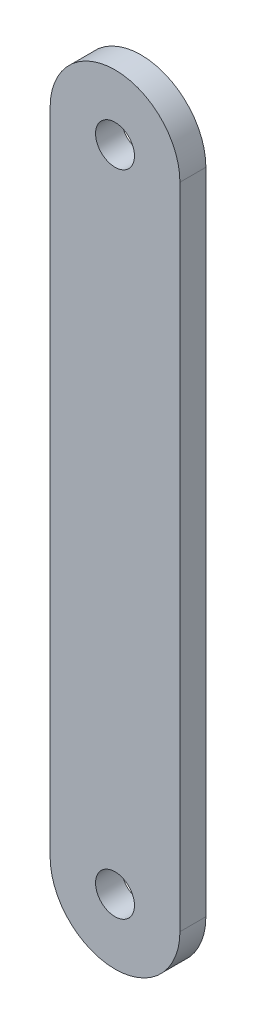
ISO-10303-21;
HEADER;
FILE_DESCRIPTION(('STEP AP214'),'2;1');
FILE_NAME('part.step','',(''),(''),'','','');
FILE_SCHEMA(('AUTOMOTIVE_DESIGN { 1 0 10303 214 1 1 1 1 }'));
ENDSEC;
DATA;
#1=APPLICATION_CONTEXT('core data for automotive mechanical design processes');
#2=APPLICATION_PROTOCOL_DEFINITION('international standard','automotive_design',2000,#1);
#3=PRODUCT_CONTEXT('',#1,'mechanical');
#4=PRODUCT('Part','Part','',(#3));
#5=PRODUCT_RELATED_PRODUCT_CATEGORY('part','',(#4));
#6=PRODUCT_DEFINITION_FORMATION('','',#4);
#7=PRODUCT_DEFINITION_CONTEXT('part definition',#1,'design');
#8=PRODUCT_DEFINITION('design','',#6,#7);
#9=PRODUCT_DEFINITION_SHAPE('','',#8);
#10=(LENGTH_UNIT() NAMED_UNIT(*) SI_UNIT(.MILLI.,.METRE.));
#11=(NAMED_UNIT(*) PLANE_ANGLE_UNIT() SI_UNIT($,.RADIAN.));
#12=(NAMED_UNIT(*) SI_UNIT($,.STERADIAN.) SOLID_ANGLE_UNIT());
#13=UNCERTAINTY_MEASURE_WITH_UNIT(LENGTH_MEASURE(1.E-05),#10,'distance_accuracy_value','');
#14=(GEOMETRIC_REPRESENTATION_CONTEXT(3) GLOBAL_UNCERTAINTY_ASSIGNED_CONTEXT((#13)) GLOBAL_UNIT_ASSIGNED_CONTEXT((#10,
#11,#12)) REPRESENTATION_CONTEXT('',''));
#15=CARTESIAN_POINT('',(0.,0.,0.));
#16=DIRECTION('',(0.,0.,1.));
#17=DIRECTION('',(1.,0.,0.));
#18=AXIS2_PLACEMENT_3D('',#15,#16,#17);
#19=CARTESIAN_POINT('',(0.,-25.,2.));
#20=DIRECTION('',(0.,0.,1.));
#21=DIRECTION('',(1.,0.,0.));
#22=AXIS2_PLACEMENT_3D('',#19,#20,#21);
#23=PLANE('',#22);
#24=CARTESIAN_POINT('',(0.,25.,2.));
#25=DIRECTION('',(0.,0.,1.));
#26=DIRECTION('',(1.,0.,0.));
#27=AXIS2_PLACEMENT_3D('',#24,#25,#26);
#28=CIRCLE('',#27,1.5);
#29=CARTESIAN_POINT('',(1.49999999999999,25.,2.));
#30=VERTEX_POINT('',#29);
#31=EDGE_CURVE('E112',#30,#30,#28,.T.);
#32=ORIENTED_EDGE('',*,*,#31,.F.);
#33=EDGE_LOOP('',(#32));
#34=FACE_BOUND('',#33,.T.);
#35=CARTESIAN_POINT('',(0.,-25.,2.));
#36=DIRECTION('',(0.,0.,1.));
#37=DIRECTION('',(1.,0.,0.));
#38=AXIS2_PLACEMENT_3D('',#35,#36,#37);
#39=CIRCLE('',#38,5.);
#40=CARTESIAN_POINT('',(-5.,-25.,2.));
#41=VERTEX_POINT('',#40);
#42=CARTESIAN_POINT('',(5.,-25.,2.));
#43=VERTEX_POINT('',#42);
#44=EDGE_CURVE('E92',#41,#43,#39,.T.);
#45=ORIENTED_EDGE('',*,*,#44,.T.);
#46=DIRECTION('',(0.,1.,0.));
#47=VECTOR('',#46,1.);
#48=CARTESIAN_POINT('',(5.,-25.,2.));
#49=LINE('',#48,#47);
#50=CARTESIAN_POINT('',(4.99999999999999,25.,2.));
#51=VERTEX_POINT('',#50);
#52=EDGE_CURVE('E87',#43,#51,#49,.T.);
#53=ORIENTED_EDGE('',*,*,#52,.T.);
#54=CARTESIAN_POINT('',(0.,25.,2.));
#55=DIRECTION('',(0.,0.,1.));
#56=DIRECTION('',(1.,0.,0.));
#57=AXIS2_PLACEMENT_3D('',#54,#55,#56);
#58=CIRCLE('',#57,5.);
#59=CARTESIAN_POINT('',(-5.00000000000001,25.,2.));
#60=VERTEX_POINT('',#59);
#61=EDGE_CURVE('E90',#51,#60,#58,.T.);
#62=ORIENTED_EDGE('',*,*,#61,.T.);
#63=DIRECTION('',(0.,-1.,0.));
#64=VECTOR('',#63,1.);
#65=CARTESIAN_POINT('',(-5.,-25.,2.));
#66=LINE('',#65,#64);
#67=EDGE_CURVE('E57',#60,#41,#66,.T.);
#68=ORIENTED_EDGE('',*,*,#67,.T.);
#69=EDGE_LOOP('',(#45,#53,#62,#68));
#70=FACE_BOUND('',#69,.T.);
#71=CARTESIAN_POINT('',(0.,-25.,2.));
#72=DIRECTION('',(0.,0.,1.));
#73=DIRECTION('',(1.,0.,0.));
#74=AXIS2_PLACEMENT_3D('',#71,#72,#73);
#75=CIRCLE('',#74,1.5);
#76=CARTESIAN_POINT('',(1.5,-25.,2.));
#77=VERTEX_POINT('',#76);
#78=EDGE_CURVE('E134',#77,#77,#75,.T.);
#79=ORIENTED_EDGE('',*,*,#78,.F.);
#80=EDGE_LOOP('',(#79));
#81=FACE_BOUND('',#80,.T.);
#82=ADVANCED_FACE('F39',(#34,#70,#81),#23,.T.);
#83=CARTESIAN_POINT('',(0.,-25.,0.));
#84=DIRECTION('',(0.,0.,1.));
#85=DIRECTION('',(1.,0.,0.));
#86=AXIS2_PLACEMENT_3D('',#83,#84,#85);
#87=PLANE('',#86);
#88=CARTESIAN_POINT('',(0.,-25.,0.));
#89=DIRECTION('',(0.,0.,1.));
#90=DIRECTION('',(1.,0.,0.));
#91=AXIS2_PLACEMENT_3D('',#88,#89,#90);
#92=CIRCLE('',#91,5.);
#93=CARTESIAN_POINT('',(-5.,-25.,0.));
#94=VERTEX_POINT('',#93);
#95=CARTESIAN_POINT('',(5.,-25.,0.));
#96=VERTEX_POINT('',#95);
#97=EDGE_CURVE('E108',#94,#96,#92,.T.);
#98=ORIENTED_EDGE('',*,*,#97,.F.);
#99=DIRECTION('',(0.,-1.,0.));
#100=VECTOR('',#99,1.);
#101=CARTESIAN_POINT('',(-5.,-25.,0.));
#102=LINE('',#101,#100);
#103=CARTESIAN_POINT('',(-5.00000000000001,25.,0.));
#104=VERTEX_POINT('',#103);
#105=EDGE_CURVE('E80',#104,#94,#102,.T.);
#106=ORIENTED_EDGE('',*,*,#105,.F.);
#107=CARTESIAN_POINT('',(0.,25.,0.));
#108=DIRECTION('',(0.,0.,1.));
#109=DIRECTION('',(1.,0.,0.));
#110=AXIS2_PLACEMENT_3D('',#107,#108,#109);
#111=CIRCLE('',#110,5.);
#112=CARTESIAN_POINT('',(4.99999999999999,25.,0.));
#113=VERTEX_POINT('',#112);
#114=EDGE_CURVE('E74',#113,#104,#111,.T.);
#115=ORIENTED_EDGE('',*,*,#114,.F.);
#116=DIRECTION('',(0.,1.,0.));
#117=VECTOR('',#116,1.);
#118=CARTESIAN_POINT('',(5.,-25.,0.));
#119=LINE('',#118,#117);
#120=EDGE_CURVE('E97',#96,#113,#119,.T.);
#121=ORIENTED_EDGE('',*,*,#120,.F.);
#122=EDGE_LOOP('',(#98,#106,#115,#121));
#123=FACE_BOUND('',#122,.T.);
#124=CARTESIAN_POINT('',(0.,25.,0.));
#125=DIRECTION('',(0.,0.,1.));
#126=DIRECTION('',(1.,0.,0.));
#127=AXIS2_PLACEMENT_3D('',#124,#125,#126);
#128=CIRCLE('',#127,1.5);
#129=CARTESIAN_POINT('',(1.49999999999999,25.,0.));
#130=VERTEX_POINT('',#129);
#131=EDGE_CURVE('E130',#130,#130,#128,.T.);
#132=ORIENTED_EDGE('',*,*,#131,.T.);
#133=EDGE_LOOP('',(#132));
#134=FACE_BOUND('',#133,.T.);
#135=CARTESIAN_POINT('',(0.,-25.,0.));
#136=DIRECTION('',(0.,0.,1.));
#137=DIRECTION('',(1.,0.,0.));
#138=AXIS2_PLACEMENT_3D('',#135,#136,#137);
#139=CIRCLE('',#138,1.5);
#140=CARTESIAN_POINT('',(1.5,-25.,0.));
#141=VERTEX_POINT('',#140);
#142=EDGE_CURVE('E138',#141,#141,#139,.T.);
#143=ORIENTED_EDGE('',*,*,#142,.T.);
#144=EDGE_LOOP('',(#143));
#145=FACE_BOUND('',#144,.T.);
#146=ADVANCED_FACE('F125',(#123,#134,#145),#87,.F.);
#147=CARTESIAN_POINT('',(0.,-25.,2.));
#148=DIRECTION('',(0.,0.,-1.));
#149=DIRECTION('',(-1.,0.,0.));
#150=AXIS2_PLACEMENT_3D('',#147,#148,#149);
#151=CYLINDRICAL_SURFACE('',#150,5.);
#152=ORIENTED_EDGE('',*,*,#97,.T.);
#153=DIRECTION('',(0.,0.,-1.));
#154=VECTOR('',#153,1.);
#155=CARTESIAN_POINT('',(5.,-25.,2.));
#156=LINE('',#155,#154);
#157=EDGE_CURVE('E11',#43,#96,#156,.T.);
#158=ORIENTED_EDGE('',*,*,#157,.F.);
#159=ORIENTED_EDGE('',*,*,#44,.F.);
#160=DIRECTION('',(0.,0.,-1.));
#161=VECTOR('',#160,1.);
#162=CARTESIAN_POINT('',(-5.,-25.,2.));
#163=LINE('',#162,#161);
#164=EDGE_CURVE('E104',#41,#94,#163,.T.);
#165=ORIENTED_EDGE('',*,*,#164,.T.);
#166=EDGE_LOOP('',(#152,#158,#159,#165));
#167=FACE_BOUND('',#166,.T.);
#168=ADVANCED_FACE('F41',(#167),#151,.T.);
#169=CARTESIAN_POINT('',(5.,-25.,2.));
#170=DIRECTION('',(-1.,0.,0.));
#171=DIRECTION('',(0.,-1.,0.));
#172=AXIS2_PLACEMENT_3D('',#169,#170,#171);
#173=PLANE('',#172);
#174=ORIENTED_EDGE('',*,*,#120,.T.);
#175=DIRECTION('',(0.,0.,-1.));
#176=VECTOR('',#175,1.);
#177=CARTESIAN_POINT('',(4.99999999999999,25.,2.));
#178=LINE('',#177,#176);
#179=EDGE_CURVE('E49',#51,#113,#178,.T.);
#180=ORIENTED_EDGE('',*,*,#179,.F.);
#181=ORIENTED_EDGE('',*,*,#52,.F.);
#182=ORIENTED_EDGE('',*,*,#157,.T.);
#183=EDGE_LOOP('',(#174,#180,#181,#182));
#184=FACE_BOUND('',#183,.T.);
#185=ADVANCED_FACE('F96',(#184),#173,.F.);
#186=CARTESIAN_POINT('',(0.,25.,2.));
#187=DIRECTION('',(0.,0.,-1.));
#188=DIRECTION('',(-1.,0.,0.));
#189=AXIS2_PLACEMENT_3D('',#186,#187,#188);
#190=CYLINDRICAL_SURFACE('',#189,5.);
#191=ORIENTED_EDGE('',*,*,#114,.T.);
#192=DIRECTION('',(0.,0.,-1.));
#193=VECTOR('',#192,1.);
#194=CARTESIAN_POINT('',(-5.00000000000001,25.,2.));
#195=LINE('',#194,#193);
#196=EDGE_CURVE('E99',#60,#104,#195,.T.);
#197=ORIENTED_EDGE('',*,*,#196,.F.);
#198=ORIENTED_EDGE('',*,*,#61,.F.);
#199=ORIENTED_EDGE('',*,*,#179,.T.);
#200=EDGE_LOOP('',(#191,#197,#198,#199));
#201=FACE_BOUND('',#200,.T.);
#202=ADVANCED_FACE('F100',(#201),#190,.T.);
#203=CARTESIAN_POINT('',(-5.,-25.,2.));
#204=DIRECTION('',(1.,0.,0.));
#205=DIRECTION('',(0.,1.,0.));
#206=AXIS2_PLACEMENT_3D('',#203,#204,#205);
#207=PLANE('',#206);
#208=ORIENTED_EDGE('',*,*,#105,.T.);
#209=ORIENTED_EDGE('',*,*,#164,.F.);
#210=ORIENTED_EDGE('',*,*,#67,.F.);
#211=ORIENTED_EDGE('',*,*,#196,.T.);
#212=EDGE_LOOP('',(#208,#209,#210,#211));
#213=FACE_BOUND('',#212,.T.);
#214=ADVANCED_FACE('F122',(#213),#207,.F.);
#215=CARTESIAN_POINT('',(0.,25.,2.));
#216=DIRECTION('',(0.,0.,-1.));
#217=DIRECTION('',(-1.,0.,0.));
#218=AXIS2_PLACEMENT_3D('',#215,#216,#217);
#219=CYLINDRICAL_SURFACE('',#218,1.5);
#220=ORIENTED_EDGE('',*,*,#31,.T.);
#221=EDGE_LOOP('',(#220));
#222=FACE_BOUND('',#221,.T.);
#223=ORIENTED_EDGE('',*,*,#131,.F.);
#224=EDGE_LOOP('',(#223));
#225=FACE_BOUND('',#224,.T.);
#226=ADVANCED_FACE('F157',(#222,#225),#219,.F.);
#227=CARTESIAN_POINT('',(0.,-25.,2.));
#228=DIRECTION('',(0.,0.,-1.));
#229=DIRECTION('',(-1.,0.,0.));
#230=AXIS2_PLACEMENT_3D('',#227,#228,#229);
#231=CYLINDRICAL_SURFACE('',#230,1.5);
#232=ORIENTED_EDGE('',*,*,#78,.T.);
#233=EDGE_LOOP('',(#232));
#234=FACE_BOUND('',#233,.T.);
#235=ORIENTED_EDGE('',*,*,#142,.F.);
#236=EDGE_LOOP('',(#235));
#237=FACE_BOUND('',#236,.T.);
#238=ADVANCED_FACE('F146',(#234,#237),#231,.F.);
#239=CLOSED_SHELL('',(#82,#146,#168,#185,#202,#214,#226,#238));
#240=MANIFOLD_SOLID_BREP('B2',#239);
#241=ADVANCED_BREP_SHAPE_REPRESENTATION('',(#18,#240),#14);
#242=SHAPE_DEFINITION_REPRESENTATION(#9,#241);
ENDSEC;
END-ISO-10303-21;
